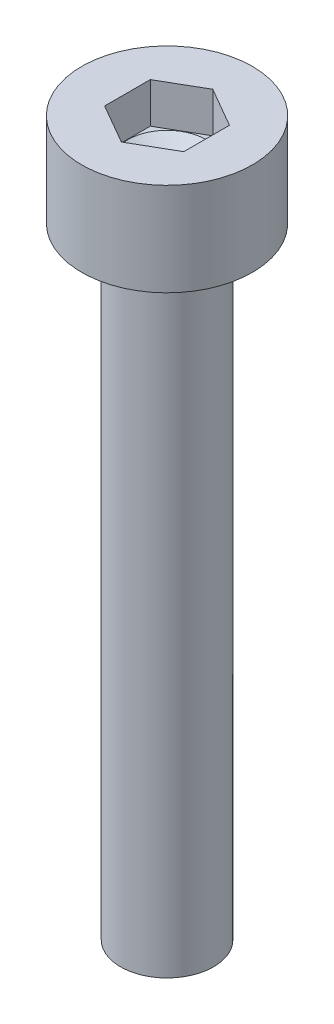
ISO-10303-21;
HEADER;
FILE_DESCRIPTION(('STEP AP214'),'2;1');
FILE_NAME('part.step','',(''),(''),'','','');
FILE_SCHEMA(('AUTOMOTIVE_DESIGN { 1 0 10303 214 1 1 1 1 }'));
ENDSEC;
DATA;
#1=APPLICATION_CONTEXT('core data for automotive mechanical design processes');
#2=APPLICATION_PROTOCOL_DEFINITION('international standard','automotive_design',2000,#1);
#3=PRODUCT_CONTEXT('',#1,'mechanical');
#4=PRODUCT('Part','Part','',(#3));
#5=PRODUCT_RELATED_PRODUCT_CATEGORY('part','',(#4));
#6=PRODUCT_DEFINITION_FORMATION('','',#4);
#7=PRODUCT_DEFINITION_CONTEXT('part definition',#1,'design');
#8=PRODUCT_DEFINITION('design','',#6,#7);
#9=PRODUCT_DEFINITION_SHAPE('','',#8);
#10=(LENGTH_UNIT() NAMED_UNIT(*) SI_UNIT(.MILLI.,.METRE.));
#11=(NAMED_UNIT(*) PLANE_ANGLE_UNIT() SI_UNIT($,.RADIAN.));
#12=(NAMED_UNIT(*) SI_UNIT($,.STERADIAN.) SOLID_ANGLE_UNIT());
#13=UNCERTAINTY_MEASURE_WITH_UNIT(LENGTH_MEASURE(1.E-05),#10,'distance_accuracy_value','');
#14=(GEOMETRIC_REPRESENTATION_CONTEXT(3) GLOBAL_UNCERTAINTY_ASSIGNED_CONTEXT((#13)) GLOBAL_UNIT_ASSIGNED_CONTEXT((#10,
#11,#12)) REPRESENTATION_CONTEXT('',''));
#15=CARTESIAN_POINT('',(0.,0.,0.));
#16=DIRECTION('',(0.,0.,1.));
#17=DIRECTION('',(1.,0.,0.));
#18=AXIS2_PLACEMENT_3D('',#15,#16,#17);
#19=CARTESIAN_POINT('',(0.,0.,0.));
#20=DIRECTION('',(0.,-1.,0.));
#21=DIRECTION('',(0.,0.,-1.));
#22=AXIS2_PLACEMENT_3D('',#19,#20,#21);
#23=PLANE('',#22);
#24=CARTESIAN_POINT('',(0.,0.,0.));
#25=DIRECTION('',(0.,-1.,0.));
#26=DIRECTION('',(0.,0.,-1.));
#27=AXIS2_PLACEMENT_3D('',#24,#25,#26);
#28=CIRCLE('',#27,2.75);
#29=CARTESIAN_POINT('',(0.,0.,-2.75));
#30=VERTEX_POINT('',#29);
#31=EDGE_CURVE('E11',#30,#30,#28,.T.);
#32=ORIENTED_EDGE('',*,*,#31,.T.);
#33=EDGE_LOOP('',(#32));
#34=FACE_BOUND('',#33,.T.);
#35=CARTESIAN_POINT('',(0.,0.,0.));
#36=DIRECTION('',(0.,-1.,0.));
#37=DIRECTION('',(0.,0.,-1.));
#38=AXIS2_PLACEMENT_3D('',#35,#36,#37);
#39=CIRCLE('',#38,1.5);
#40=CARTESIAN_POINT('',(0.,0.,-1.5));
#41=VERTEX_POINT('',#40);
#42=EDGE_CURVE('E143',#41,#41,#39,.T.);
#43=ORIENTED_EDGE('',*,*,#42,.F.);
#44=EDGE_LOOP('',(#43));
#45=FACE_BOUND('',#44,.T.);
#46=ADVANCED_FACE('F17',(#34,#45),#23,.T.);
#47=CARTESIAN_POINT('',(0.,0.,0.));
#48=DIRECTION('',(0.,-1.,0.));
#49=DIRECTION('',(0.,0.,-1.));
#50=AXIS2_PLACEMENT_3D('',#47,#48,#49);
#51=CYLINDRICAL_SURFACE('',#50,2.75);
#52=CARTESIAN_POINT('',(0.,3.,0.));
#53=DIRECTION('',(0.,-1.,0.));
#54=DIRECTION('',(0.,0.,-1.));
#55=AXIS2_PLACEMENT_3D('',#52,#53,#54);
#56=CIRCLE('',#55,2.75);
#57=CARTESIAN_POINT('',(0.,3.,-2.75));
#58=VERTEX_POINT('',#57);
#59=EDGE_CURVE('E24',#58,#58,#56,.T.);
#60=ORIENTED_EDGE('',*,*,#59,.T.);
#61=EDGE_LOOP('',(#60));
#62=FACE_BOUND('',#61,.T.);
#63=ORIENTED_EDGE('',*,*,#31,.F.);
#64=EDGE_LOOP('',(#63));
#65=FACE_BOUND('',#64,.T.);
#66=ADVANCED_FACE('F120',(#62,#65),#51,.T.);
#67=CARTESIAN_POINT('',(2.75,3.,0.));
#68=DIRECTION('',(0.,1.,0.));
#69=DIRECTION('',(0.,0.,1.));
#70=AXIS2_PLACEMENT_3D('',#67,#68,#69);
#71=PLANE('',#70);
#72=DIRECTION('',(-0.866025403784439,0.,-0.5));
#73=VECTOR('',#72,1.);
#74=CARTESIAN_POINT('',(1.275,3.,-0.736121593216773));
#75=LINE('',#74,#73);
#76=CARTESIAN_POINT('',(1.275,3.,-0.736121593216773));
#77=VERTEX_POINT('',#76);
#78=CARTESIAN_POINT('',(0.,3.,-1.47224318643355));
#79=VERTEX_POINT('',#78);
#80=EDGE_CURVE('E31',#77,#79,#75,.T.);
#81=ORIENTED_EDGE('',*,*,#80,.F.);
#82=DIRECTION('',(0.,0.,-1.));
#83=VECTOR('',#82,1.);
#84=CARTESIAN_POINT('',(1.275,3.,0.736121593216772));
#85=LINE('',#84,#83);
#86=CARTESIAN_POINT('',(1.275,3.,0.736121593216772));
#87=VERTEX_POINT('',#86);
#88=EDGE_CURVE('E101',#87,#77,#85,.T.);
#89=ORIENTED_EDGE('',*,*,#88,.F.);
#90=DIRECTION('',(0.866025403784439,0.,-0.5));
#91=VECTOR('',#90,1.);
#92=CARTESIAN_POINT('',(0.,3.,1.47224318643355));
#93=LINE('',#92,#91);
#94=CARTESIAN_POINT('',(0.,3.,1.47224318643355));
#95=VERTEX_POINT('',#94);
#96=EDGE_CURVE('E95',#95,#87,#93,.T.);
#97=ORIENTED_EDGE('',*,*,#96,.F.);
#98=DIRECTION('',(0.866025403784439,0.,0.5));
#99=VECTOR('',#98,1.);
#100=CARTESIAN_POINT('',(-1.275,3.,0.736121593216773));
#101=LINE('',#100,#99);
#102=CARTESIAN_POINT('',(-1.275,3.,0.736121593216773));
#103=VERTEX_POINT('',#102);
#104=EDGE_CURVE('E93',#103,#95,#101,.T.);
#105=ORIENTED_EDGE('',*,*,#104,.F.);
#106=DIRECTION('',(0.,0.,1.));
#107=VECTOR('',#106,1.);
#108=CARTESIAN_POINT('',(-1.275,3.,-0.736121593216773));
#109=LINE('',#108,#107);
#110=CARTESIAN_POINT('',(-1.275,3.,-0.736121593216773));
#111=VERTEX_POINT('',#110);
#112=EDGE_CURVE('E75',#111,#103,#109,.T.);
#113=ORIENTED_EDGE('',*,*,#112,.F.);
#114=DIRECTION('',(-0.866025403784439,0.,0.5));
#115=VECTOR('',#114,1.);
#116=CARTESIAN_POINT('',(0.,3.,-1.47224318643354));
#117=LINE('',#116,#115);
#118=EDGE_CURVE('E85',#79,#111,#117,.T.);
#119=ORIENTED_EDGE('',*,*,#118,.F.);
#120=EDGE_LOOP('',(#81,#89,#97,#105,#113,#119));
#121=FACE_BOUND('',#120,.T.);
#122=ORIENTED_EDGE('',*,*,#59,.F.);
#123=EDGE_LOOP('',(#122));
#124=FACE_BOUND('',#123,.T.);
#125=ADVANCED_FACE('F89',(#121,#124),#71,.T.);
#126=CARTESIAN_POINT('',(1.275,-2.19518934071246,-0.736121593216773));
#127=DIRECTION('',(0.5,0.,-0.866025403784439));
#128=DIRECTION('',(-0.866025403784439,0.,-0.5));
#129=AXIS2_PLACEMENT_3D('',#126,#127,#128);
#130=PLANE('',#129);
#131=DIRECTION('',(0.866025403784439,0.,0.5));
#132=VECTOR('',#131,1.);
#133=CARTESIAN_POINT('',(1.275,1.7,-0.736121593216773));
#134=LINE('',#133,#132);
#135=CARTESIAN_POINT('',(0.,1.7,-1.47224318643354));
#136=VERTEX_POINT('',#135);
#137=CARTESIAN_POINT('',(1.275,1.7,-0.736121593216773));
#138=VERTEX_POINT('',#137);
#139=EDGE_CURVE('E115',#136,#138,#134,.T.);
#140=ORIENTED_EDGE('',*,*,#139,.T.);
#141=DIRECTION('',(0.,1.,0.));
#142=VECTOR('',#141,1.);
#143=CARTESIAN_POINT('',(1.275,-2.19518934071246,-0.736121593216773));
#144=LINE('',#143,#142);
#145=EDGE_CURVE('E104',#138,#77,#144,.T.);
#146=ORIENTED_EDGE('',*,*,#145,.T.);
#147=ORIENTED_EDGE('',*,*,#80,.T.);
#148=DIRECTION('',(0.,1.,0.));
#149=VECTOR('',#148,1.);
#150=CARTESIAN_POINT('',(0.,-2.19518934071246,-1.47224318643354));
#151=LINE('',#150,#149);
#152=EDGE_CURVE('E82',#136,#79,#151,.T.);
#153=ORIENTED_EDGE('',*,*,#152,.F.);
#154=EDGE_LOOP('',(#140,#146,#147,#153));
#155=FACE_BOUND('',#154,.T.);
#156=ADVANCED_FACE('F123',(#155),#130,.F.);
#157=CARTESIAN_POINT('',(1.275,-2.19518934071246,0.736121593216772));
#158=DIRECTION('',(1.,0.,0.));
#159=DIRECTION('',(0.,0.,-1.));
#160=AXIS2_PLACEMENT_3D('',#157,#158,#159);
#161=PLANE('',#160);
#162=DIRECTION('',(0.,0.,1.));
#163=VECTOR('',#162,1.);
#164=CARTESIAN_POINT('',(1.275,1.7,0.736121593216772));
#165=LINE('',#164,#163);
#166=CARTESIAN_POINT('',(1.275,1.7,0.736121593216772));
#167=VERTEX_POINT('',#166);
#168=EDGE_CURVE('E155',#138,#167,#165,.T.);
#169=ORIENTED_EDGE('',*,*,#168,.T.);
#170=DIRECTION('',(0.,1.,0.));
#171=VECTOR('',#170,1.);
#172=CARTESIAN_POINT('',(1.275,-2.19518934071246,0.736121593216772));
#173=LINE('',#172,#171);
#174=EDGE_CURVE('E106',#167,#87,#173,.T.);
#175=ORIENTED_EDGE('',*,*,#174,.T.);
#176=ORIENTED_EDGE('',*,*,#88,.T.);
#177=ORIENTED_EDGE('',*,*,#145,.F.);
#178=EDGE_LOOP('',(#169,#175,#176,#177));
#179=FACE_BOUND('',#178,.T.);
#180=ADVANCED_FACE('F131',(#179),#161,.F.);
#181=CARTESIAN_POINT('',(0.,-2.19518934071246,1.47224318643355));
#182=DIRECTION('',(0.5,0.,0.866025403784438));
#183=DIRECTION('',(0.866025403784439,0.,-0.5));
#184=AXIS2_PLACEMENT_3D('',#181,#182,#183);
#185=PLANE('',#184);
#186=DIRECTION('',(-0.866025403784439,0.,0.5));
#187=VECTOR('',#186,1.);
#188=CARTESIAN_POINT('',(0.,1.7,1.47224318643355));
#189=LINE('',#188,#187);
#190=CARTESIAN_POINT('',(0.,1.7,1.47224318643355));
#191=VERTEX_POINT('',#190);
#192=EDGE_CURVE('E153',#167,#191,#189,.T.);
#193=ORIENTED_EDGE('',*,*,#192,.T.);
#194=DIRECTION('',(0.,1.,0.));
#195=VECTOR('',#194,1.);
#196=CARTESIAN_POINT('',(0.,-2.19518934071246,1.47224318643355));
#197=LINE('',#196,#195);
#198=EDGE_CURVE('E108',#191,#95,#197,.T.);
#199=ORIENTED_EDGE('',*,*,#198,.T.);
#200=ORIENTED_EDGE('',*,*,#96,.T.);
#201=ORIENTED_EDGE('',*,*,#174,.F.);
#202=EDGE_LOOP('',(#193,#199,#200,#201));
#203=FACE_BOUND('',#202,.T.);
#204=ADVANCED_FACE('F168',(#203),#185,.F.);
#205=CARTESIAN_POINT('',(-1.275,-2.19518934071246,0.736121593216773));
#206=DIRECTION('',(-0.5,0.,0.866025403784439));
#207=DIRECTION('',(0.866025403784439,0.,0.5));
#208=AXIS2_PLACEMENT_3D('',#205,#206,#207);
#209=PLANE('',#208);
#210=DIRECTION('',(-0.866025403784439,0.,-0.5));
#211=VECTOR('',#210,1.);
#212=CARTESIAN_POINT('',(-1.275,1.7,0.736121593216773));
#213=LINE('',#212,#211);
#214=CARTESIAN_POINT('',(-1.275,1.7,0.736121593216773));
#215=VERTEX_POINT('',#214);
#216=EDGE_CURVE('E151',#191,#215,#213,.T.);
#217=ORIENTED_EDGE('',*,*,#216,.T.);
#218=DIRECTION('',(0.,1.,0.));
#219=VECTOR('',#218,1.);
#220=CARTESIAN_POINT('',(-1.275,-2.19518934071246,0.736121593216773));
#221=LINE('',#220,#219);
#222=EDGE_CURVE('E81',#215,#103,#221,.T.);
#223=ORIENTED_EDGE('',*,*,#222,.T.);
#224=ORIENTED_EDGE('',*,*,#104,.T.);
#225=ORIENTED_EDGE('',*,*,#198,.F.);
#226=EDGE_LOOP('',(#217,#223,#224,#225));
#227=FACE_BOUND('',#226,.T.);
#228=ADVANCED_FACE('F171',(#227),#209,.F.);
#229=CARTESIAN_POINT('',(-1.275,-2.19518934071246,-0.736121593216773));
#230=DIRECTION('',(-1.,0.,0.));
#231=DIRECTION('',(0.,0.,1.));
#232=AXIS2_PLACEMENT_3D('',#229,#230,#231);
#233=PLANE('',#232);
#234=DIRECTION('',(0.,0.,-1.));
#235=VECTOR('',#234,1.);
#236=CARTESIAN_POINT('',(-1.275,1.7,-0.736121593216773));
#237=LINE('',#236,#235);
#238=CARTESIAN_POINT('',(-1.275,1.7,-0.736121593216773));
#239=VERTEX_POINT('',#238);
#240=EDGE_CURVE('E78',#215,#239,#237,.T.);
#241=ORIENTED_EDGE('',*,*,#240,.T.);
#242=DIRECTION('',(0.,1.,0.));
#243=VECTOR('',#242,1.);
#244=CARTESIAN_POINT('',(-1.275,-2.19518934071246,-0.736121593216773));
#245=LINE('',#244,#243);
#246=EDGE_CURVE('E70',#239,#111,#245,.T.);
#247=ORIENTED_EDGE('',*,*,#246,.T.);
#248=ORIENTED_EDGE('',*,*,#112,.T.);
#249=ORIENTED_EDGE('',*,*,#222,.F.);
#250=EDGE_LOOP('',(#241,#247,#248,#249));
#251=FACE_BOUND('',#250,.T.);
#252=ADVANCED_FACE('F72',(#251),#233,.F.);
#253=CARTESIAN_POINT('',(0.,-2.19518934071246,-1.47224318643354));
#254=DIRECTION('',(-0.5,0.,-0.866025403784439));
#255=DIRECTION('',(-0.866025403784439,0.,0.5));
#256=AXIS2_PLACEMENT_3D('',#253,#254,#255);
#257=PLANE('',#256);
#258=DIRECTION('',(0.866025403784439,0.,-0.5));
#259=VECTOR('',#258,1.);
#260=CARTESIAN_POINT('',(0.,1.7,-1.47224318643354));
#261=LINE('',#260,#259);
#262=EDGE_CURVE('E112',#239,#136,#261,.T.);
#263=ORIENTED_EDGE('',*,*,#262,.T.);
#264=ORIENTED_EDGE('',*,*,#152,.T.);
#265=ORIENTED_EDGE('',*,*,#118,.T.);
#266=ORIENTED_EDGE('',*,*,#246,.F.);
#267=EDGE_LOOP('',(#263,#264,#265,#266));
#268=FACE_BOUND('',#267,.T.);
#269=ADVANCED_FACE('F86',(#268),#257,.F.);
#270=CARTESIAN_POINT('',(0.,1.7,0.));
#271=DIRECTION('',(0.,1.,0.));
#272=DIRECTION('',(0.,0.,1.));
#273=AXIS2_PLACEMENT_3D('',#270,#271,#272);
#274=PLANE('',#273);
#275=CARTESIAN_POINT('',(0.,1.7,0.));
#276=DIRECTION('',(0.,1.,0.));
#277=DIRECTION('',(0.,0.,1.));
#278=AXIS2_PLACEMENT_3D('',#275,#276,#277);
#279=CIRCLE('',#278,1.26);
#280=CARTESIAN_POINT('',(0.,1.7,1.26));
#281=VERTEX_POINT('',#280);
#282=EDGE_CURVE('E114',#281,#281,#279,.T.);
#283=ORIENTED_EDGE('',*,*,#282,.F.);
#284=EDGE_LOOP('',(#283));
#285=FACE_BOUND('',#284,.T.);
#286=ORIENTED_EDGE('',*,*,#139,.F.);
#287=ORIENTED_EDGE('',*,*,#262,.F.);
#288=ORIENTED_EDGE('',*,*,#240,.F.);
#289=ORIENTED_EDGE('',*,*,#216,.F.);
#290=ORIENTED_EDGE('',*,*,#192,.F.);
#291=ORIENTED_EDGE('',*,*,#168,.F.);
#292=EDGE_LOOP('',(#286,#287,#288,#289,#290,#291));
#293=FACE_BOUND('',#292,.T.);
#294=ADVANCED_FACE('F162',(#285,#293),#274,.T.);
#295=CARTESIAN_POINT('',(0.,1.7,0.));
#296=DIRECTION('',(0.,1.,0.));
#297=DIRECTION('',(0.,0.,1.));
#298=AXIS2_PLACEMENT_3D('',#295,#296,#297);
#299=CONICAL_SURFACE('',#298,1.26,1.0471975511966);
#300=CARTESIAN_POINT('',(0.,0.972538660821063,0.));
#301=VERTEX_POINT('',#300);
#302=VERTEX_LOOP('',#301);
#303=FACE_BOUND('',#302,.T.);
#304=ORIENTED_EDGE('',*,*,#282,.T.);
#305=EDGE_LOOP('',(#304));
#306=FACE_BOUND('',#305,.T.);
#307=ADVANCED_FACE('F184',(#303,#306),#299,.F.);
#308=CARTESIAN_POINT('',(0.,-20.,0.));
#309=DIRECTION('',(0.,1.,0.));
#310=DIRECTION('',(0.,0.,1.));
#311=AXIS2_PLACEMENT_3D('',#308,#309,#310);
#312=CYLINDRICAL_SURFACE('',#311,1.5);
#313=CARTESIAN_POINT('',(0.,-20.,0.));
#314=DIRECTION('',(0.,-1.,0.));
#315=DIRECTION('',(0.,0.,-1.));
#316=AXIS2_PLACEMENT_3D('',#313,#314,#315);
#317=CIRCLE('',#316,1.5);
#318=CARTESIAN_POINT('',(0.,-20.,-1.5));
#319=VERTEX_POINT('',#318);
#320=EDGE_CURVE('E145',#319,#319,#317,.T.);
#321=ORIENTED_EDGE('',*,*,#320,.F.);
#322=EDGE_LOOP('',(#321));
#323=FACE_BOUND('',#322,.T.);
#324=ORIENTED_EDGE('',*,*,#42,.T.);
#325=EDGE_LOOP('',(#324));
#326=FACE_BOUND('',#325,.T.);
#327=ADVANCED_FACE('F186',(#323,#326),#312,.T.);
#328=CARTESIAN_POINT('',(0.,-20.,0.));
#329=DIRECTION('',(0.,-1.,0.));
#330=DIRECTION('',(0.,0.,-1.));
#331=AXIS2_PLACEMENT_3D('',#328,#329,#330);
#332=PLANE('',#331);
#333=ORIENTED_EDGE('',*,*,#320,.T.);
#334=EDGE_LOOP('',(#333));
#335=FACE_BOUND('',#334,.T.);
#336=ADVANCED_FACE('F192',(#335),#332,.T.);
#337=CLOSED_SHELL('',(#46,#66,#125,#156,#180,#204,#228,#252,#269,#294,#307,#327,#336));
#338=MANIFOLD_SOLID_BREP('B1',#337);
#339=ADVANCED_BREP_SHAPE_REPRESENTATION('',(#18,#338),#14);
#340=SHAPE_DEFINITION_REPRESENTATION(#9,#339);
ENDSEC;
END-ISO-10303-21;
